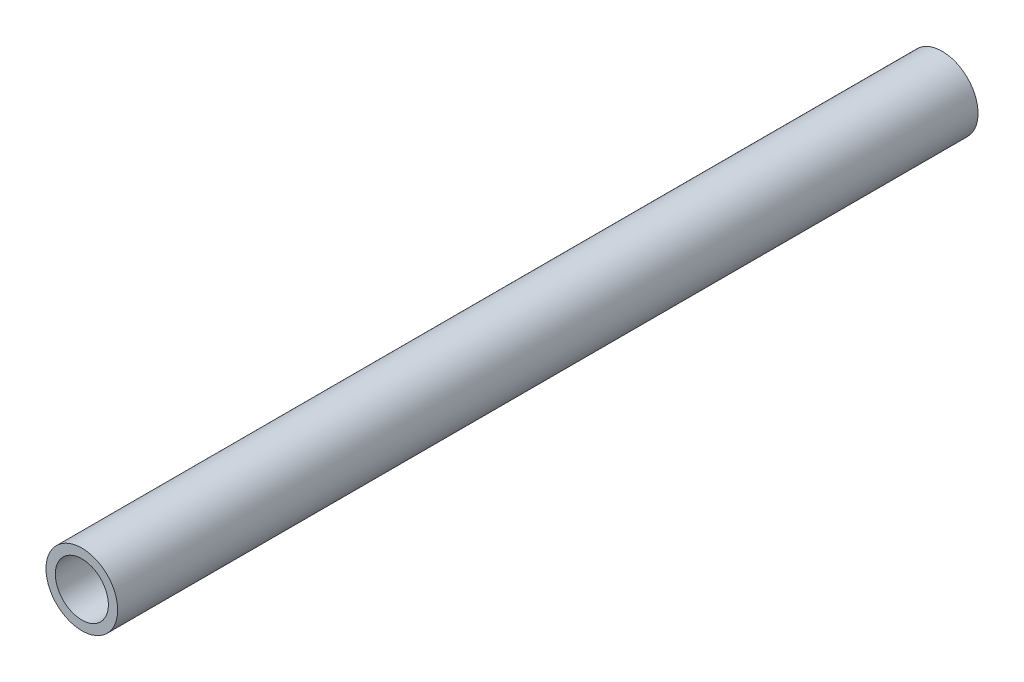
ISO-10303-21;
HEADER;
FILE_DESCRIPTION(('STEP AP214'),'2;1');
FILE_NAME('part.step','',(''),(''),'','','');
FILE_SCHEMA(('AUTOMOTIVE_DESIGN { 1 0 10303 214 1 1 1 1 }'));
ENDSEC;
DATA;
#1=APPLICATION_CONTEXT('core data for automotive mechanical design processes');
#2=APPLICATION_PROTOCOL_DEFINITION('international standard','automotive_design',2000,#1);
#3=PRODUCT_CONTEXT('',#1,'mechanical');
#4=PRODUCT('Part','Part','',(#3));
#5=PRODUCT_RELATED_PRODUCT_CATEGORY('part','',(#4));
#6=PRODUCT_DEFINITION_FORMATION('','',#4);
#7=PRODUCT_DEFINITION_CONTEXT('part definition',#1,'design');
#8=PRODUCT_DEFINITION('design','',#6,#7);
#9=PRODUCT_DEFINITION_SHAPE('','',#8);
#10=(LENGTH_UNIT() NAMED_UNIT(*) SI_UNIT(.MILLI.,.METRE.));
#11=(NAMED_UNIT(*) PLANE_ANGLE_UNIT() SI_UNIT($,.RADIAN.));
#12=(NAMED_UNIT(*) SI_UNIT($,.STERADIAN.) SOLID_ANGLE_UNIT());
#13=UNCERTAINTY_MEASURE_WITH_UNIT(LENGTH_MEASURE(1.E-05),#10,'distance_accuracy_value','');
#14=(GEOMETRIC_REPRESENTATION_CONTEXT(3) GLOBAL_UNCERTAINTY_ASSIGNED_CONTEXT((#13)) GLOBAL_UNIT_ASSIGNED_CONTEXT((#10,
#11,#12)) REPRESENTATION_CONTEXT('',''));
#15=CARTESIAN_POINT('',(0.,0.,0.));
#16=DIRECTION('',(0.,0.,1.));
#17=DIRECTION('',(1.,0.,0.));
#18=AXIS2_PLACEMENT_3D('',#15,#16,#17);
#19=CARTESIAN_POINT('',(0.,0.,76.2));
#20=DIRECTION('',(0.,0.,1.));
#21=DIRECTION('',(1.,0.,0.));
#22=AXIS2_PLACEMENT_3D('',#19,#20,#21);
#23=PLANE('',#22);
#24=CARTESIAN_POINT('',(0.,0.,76.2));
#25=DIRECTION('',(0.,0.,1.));
#26=DIRECTION('',(1.,0.,0.));
#27=AXIS2_PLACEMENT_3D('',#24,#25,#26);
#28=CIRCLE('',#27,6.35);
#29=CARTESIAN_POINT('',(-6.35,0.,76.2));
#30=VERTEX_POINT('',#29);
#31=EDGE_CURVE('E10',#30,#30,#28,.T.);
#32=ORIENTED_EDGE('',*,*,#31,.T.);
#33=EDGE_LOOP('',(#32));
#34=FACE_BOUND('',#33,.T.);
#35=CARTESIAN_POINT('',(0.,0.,76.2));
#36=DIRECTION('',(0.,0.,1.));
#37=DIRECTION('',(1.,0.,0.));
#38=AXIS2_PLACEMENT_3D('',#35,#36,#37);
#39=CIRCLE('',#38,4.699);
#40=CARTESIAN_POINT('',(-4.699,0.,76.2));
#41=VERTEX_POINT('',#40);
#42=EDGE_CURVE('E41',#41,#41,#39,.T.);
#43=ORIENTED_EDGE('',*,*,#42,.F.);
#44=EDGE_LOOP('',(#43));
#45=FACE_BOUND('',#44,.T.);
#46=ADVANCED_FACE('F30',(#34,#45),#23,.T.);
#47=CARTESIAN_POINT('',(0.,0.,-76.2));
#48=DIRECTION('',(0.,0.,1.));
#49=DIRECTION('',(1.,0.,0.));
#50=AXIS2_PLACEMENT_3D('',#47,#48,#49);
#51=PLANE('',#50);
#52=CARTESIAN_POINT('',(0.,0.,-76.2));
#53=DIRECTION('',(0.,0.,1.));
#54=DIRECTION('',(1.,0.,0.));
#55=AXIS2_PLACEMENT_3D('',#52,#53,#54);
#56=CIRCLE('',#55,6.35);
#57=CARTESIAN_POINT('',(-6.35,0.,-76.2));
#58=VERTEX_POINT('',#57);
#59=EDGE_CURVE('E34',#58,#58,#56,.T.);
#60=ORIENTED_EDGE('',*,*,#59,.F.);
#61=EDGE_LOOP('',(#60));
#62=FACE_BOUND('',#61,.T.);
#63=CARTESIAN_POINT('',(0.,0.,-76.2));
#64=DIRECTION('',(0.,0.,1.));
#65=DIRECTION('',(1.,0.,0.));
#66=AXIS2_PLACEMENT_3D('',#63,#64,#65);
#67=CIRCLE('',#66,4.699);
#68=CARTESIAN_POINT('',(-4.699,0.,-76.2));
#69=VERTEX_POINT('',#68);
#70=EDGE_CURVE('E43',#69,#69,#67,.T.);
#71=ORIENTED_EDGE('',*,*,#70,.T.);
#72=EDGE_LOOP('',(#71));
#73=FACE_BOUND('',#72,.T.);
#74=ADVANCED_FACE('F53',(#62,#73),#51,.F.);
#75=CARTESIAN_POINT('',(0.,0.,76.2));
#76=DIRECTION('',(0.,0.,-1.));
#77=DIRECTION('',(-1.,0.,0.));
#78=AXIS2_PLACEMENT_3D('',#75,#76,#77);
#79=CYLINDRICAL_SURFACE('',#78,6.35);
#80=CARTESIAN_POINT('',(-6.35,0.,76.2));
#81=CARTESIAN_POINT('',(-6.35,0.,74.6125));
#82=CARTESIAN_POINT('',(-6.35,0.,73.025));
#83=CARTESIAN_POINT('',(-6.35,0.,69.85));
#84=CARTESIAN_POINT('',(-6.35,0.,68.2625));
#85=CARTESIAN_POINT('',(-6.35,0.,65.0875));
#86=CARTESIAN_POINT('',(-6.35,0.,63.5));
#87=CARTESIAN_POINT('',(-6.35,0.,60.325));
#88=CARTESIAN_POINT('',(-6.35,0.,58.7375));
#89=CARTESIAN_POINT('',(-6.35,0.,55.5625));
#90=CARTESIAN_POINT('',(-6.35,0.,53.975));
#91=CARTESIAN_POINT('',(-6.35,0.,50.8));
#92=CARTESIAN_POINT('',(-6.35,0.,49.2125));
#93=CARTESIAN_POINT('',(-6.35,0.,46.0375));
#94=CARTESIAN_POINT('',(-6.35,0.,44.45));
#95=CARTESIAN_POINT('',(-6.35,0.,41.275));
#96=CARTESIAN_POINT('',(-6.35,0.,39.6875));
#97=CARTESIAN_POINT('',(-6.35,0.,36.5125));
#98=CARTESIAN_POINT('',(-6.35,0.,34.925));
#99=CARTESIAN_POINT('',(-6.35,0.,31.75));
#100=CARTESIAN_POINT('',(-6.35,0.,30.1625));
#101=CARTESIAN_POINT('',(-6.35,0.,26.9875));
#102=CARTESIAN_POINT('',(-6.35,0.,25.4));
#103=CARTESIAN_POINT('',(-6.35,0.,22.225));
#104=CARTESIAN_POINT('',(-6.35,0.,20.6375));
#105=CARTESIAN_POINT('',(-6.35,0.,17.4625));
#106=CARTESIAN_POINT('',(-6.35,0.,15.875));
#107=CARTESIAN_POINT('',(-6.35,0.,12.7));
#108=CARTESIAN_POINT('',(-6.35,0.,11.1125));
#109=CARTESIAN_POINT('',(-6.35,0.,7.93750000000001));
#110=CARTESIAN_POINT('',(-6.35,0.,6.35));
#111=CARTESIAN_POINT('',(-6.35,0.,3.175));
#112=CARTESIAN_POINT('',(-6.35,0.,1.5875));
#113=CARTESIAN_POINT('',(-6.35,0.,-1.5875));
#114=CARTESIAN_POINT('',(-6.35,0.,-3.175));
#115=CARTESIAN_POINT('',(-6.35,0.,-6.35));
#116=CARTESIAN_POINT('',(-6.35,0.,-7.93750000000001));
#117=CARTESIAN_POINT('',(-6.35,0.,-11.1125));
#118=CARTESIAN_POINT('',(-6.35,0.,-12.7));
#119=CARTESIAN_POINT('',(-6.35,0.,-15.875));
#120=CARTESIAN_POINT('',(-6.35,0.,-17.4625));
#121=CARTESIAN_POINT('',(-6.35,0.,-20.6375));
#122=CARTESIAN_POINT('',(-6.35,0.,-22.225));
#123=CARTESIAN_POINT('',(-6.35,0.,-25.4));
#124=CARTESIAN_POINT('',(-6.35,0.,-26.9875));
#125=CARTESIAN_POINT('',(-6.35,0.,-30.1625));
#126=CARTESIAN_POINT('',(-6.35,0.,-31.75));
#127=CARTESIAN_POINT('',(-6.35,0.,-34.925));
#128=CARTESIAN_POINT('',(-6.35,0.,-36.5125));
#129=CARTESIAN_POINT('',(-6.35,0.,-39.6875));
#130=CARTESIAN_POINT('',(-6.35,0.,-41.275));
#131=CARTESIAN_POINT('',(-6.35,0.,-44.45));
#132=CARTESIAN_POINT('',(-6.35,0.,-46.0375));
#133=CARTESIAN_POINT('',(-6.35,0.,-49.2125));
#134=CARTESIAN_POINT('',(-6.35,0.,-50.8));
#135=CARTESIAN_POINT('',(-6.35,0.,-53.975));
#136=CARTESIAN_POINT('',(-6.35,0.,-55.5625));
#137=CARTESIAN_POINT('',(-6.35,0.,-58.7375));
#138=CARTESIAN_POINT('',(-6.35,0.,-60.325));
#139=CARTESIAN_POINT('',(-6.35,0.,-63.5));
#140=CARTESIAN_POINT('',(-6.35,0.,-65.0875));
#141=CARTESIAN_POINT('',(-6.35,0.,-68.2625));
#142=CARTESIAN_POINT('',(-6.35,0.,-69.85));
#143=CARTESIAN_POINT('',(-6.35,0.,-73.025));
#144=CARTESIAN_POINT('',(-6.35,0.,-74.6125));
#145=CARTESIAN_POINT('',(-6.35,0.,-76.2));
#146=B_SPLINE_CURVE_WITH_KNOTS('',3,(#80,#81,#82,#83,#84,#85,#86,#87,#88,#89,#90,#91,#92,#93,
#94,#95,#96,#97,#98,#99,#100,#101,#102,#103,#104,#105,#106,#107,#108,#109,#110,#111,#112,#113,
#114,#115,#116,#117,#118,#119,#120,#121,#122,#123,#124,#125,#126,#127,#128,#129,#130,#131,#132,
#133,#134,#135,#136,#137,#138,#139,#140,#141,#142,#143,#144,#145),.UNSPECIFIED.,.F.,.F.,(4,2,2,
2,2,2,2,2,2,2,2,2,2,2,2,2,2,2,2,2,2,2,2,2,2,2,2,2,2,2,2,2,4),(0.,4.7625,9.52500000000001,
14.2875,19.05,23.8125,28.575,33.3375,38.1,42.8625,47.625,52.3875,57.15,61.9125,66.675,71.4375,
76.2,80.9625,85.725,90.4875,95.25,100.0125,104.775,109.5375,114.3,119.0625,123.825,128.5875,
133.35,138.1125,142.875,147.6375,152.4),.UNSPECIFIED.);
#147=EDGE_CURVE('BSEAM32',#30,#58,#146,.T.);
#148=ORIENTED_EDGE('',*,*,#31,.F.);
#149=ORIENTED_EDGE('',*,*,#59,.T.);
#150=ORIENTED_EDGE('',*,*,#147,.T.);
#151=ORIENTED_EDGE('',*,*,#147,.F.);
#152=EDGE_LOOP('',(#148,#150,#149,#151));
#153=FACE_BOUND('',#152,.T.);
#154=ADVANCED_FACE('F32',(#153),#79,.T.);
#155=CARTESIAN_POINT('',(0.,0.,76.2));
#156=DIRECTION('',(0.,0.,-1.));
#157=DIRECTION('',(-1.,0.,0.));
#158=AXIS2_PLACEMENT_3D('',#155,#156,#157);
#159=CYLINDRICAL_SURFACE('',#158,4.699);
#160=CARTESIAN_POINT('',(-4.699,0.,76.2));
#161=CARTESIAN_POINT('',(-4.699,0.,74.6125));
#162=CARTESIAN_POINT('',(-4.699,0.,73.025));
#163=CARTESIAN_POINT('',(-4.699,0.,69.85));
#164=CARTESIAN_POINT('',(-4.699,0.,68.2625));
#165=CARTESIAN_POINT('',(-4.699,0.,65.0875));
#166=CARTESIAN_POINT('',(-4.699,0.,63.5));
#167=CARTESIAN_POINT('',(-4.699,0.,60.325));
#168=CARTESIAN_POINT('',(-4.699,0.,58.7375));
#169=CARTESIAN_POINT('',(-4.699,0.,55.5625));
#170=CARTESIAN_POINT('',(-4.699,0.,53.975));
#171=CARTESIAN_POINT('',(-4.699,0.,50.8));
#172=CARTESIAN_POINT('',(-4.699,0.,49.2125));
#173=CARTESIAN_POINT('',(-4.699,0.,46.0375));
#174=CARTESIAN_POINT('',(-4.699,0.,44.45));
#175=CARTESIAN_POINT('',(-4.699,0.,41.275));
#176=CARTESIAN_POINT('',(-4.699,0.,39.6875));
#177=CARTESIAN_POINT('',(-4.699,0.,36.5125));
#178=CARTESIAN_POINT('',(-4.699,0.,34.925));
#179=CARTESIAN_POINT('',(-4.699,0.,31.75));
#180=CARTESIAN_POINT('',(-4.699,0.,30.1625));
#181=CARTESIAN_POINT('',(-4.699,0.,26.9875));
#182=CARTESIAN_POINT('',(-4.699,0.,25.4));
#183=CARTESIAN_POINT('',(-4.699,0.,22.225));
#184=CARTESIAN_POINT('',(-4.699,0.,20.6375));
#185=CARTESIAN_POINT('',(-4.699,0.,17.4625));
#186=CARTESIAN_POINT('',(-4.699,0.,15.875));
#187=CARTESIAN_POINT('',(-4.699,0.,12.7));
#188=CARTESIAN_POINT('',(-4.699,0.,11.1125));
#189=CARTESIAN_POINT('',(-4.699,0.,7.93749999999999));
#190=CARTESIAN_POINT('',(-4.699,0.,6.34999999999999));
#191=CARTESIAN_POINT('',(-4.699,0.,3.17499999999999));
#192=CARTESIAN_POINT('',(-4.699,0.,1.58749999999999));
#193=CARTESIAN_POINT('',(-4.699,0.,-1.58750000000001));
#194=CARTESIAN_POINT('',(-4.699,0.,-3.17500000000002));
#195=CARTESIAN_POINT('',(-4.699,0.,-6.35000000000002));
#196=CARTESIAN_POINT('',(-4.699,0.,-7.93750000000002));
#197=CARTESIAN_POINT('',(-4.699,0.,-11.1125));
#198=CARTESIAN_POINT('',(-4.699,0.,-12.7));
#199=CARTESIAN_POINT('',(-4.699,0.,-15.875));
#200=CARTESIAN_POINT('',(-4.699,0.,-17.4625));
#201=CARTESIAN_POINT('',(-4.699,0.,-20.6375));
#202=CARTESIAN_POINT('',(-4.699,0.,-22.225));
#203=CARTESIAN_POINT('',(-4.699,0.,-25.4));
#204=CARTESIAN_POINT('',(-4.699,0.,-26.9875));
#205=CARTESIAN_POINT('',(-4.699,0.,-30.1625));
#206=CARTESIAN_POINT('',(-4.699,0.,-31.75));
#207=CARTESIAN_POINT('',(-4.699,0.,-34.925));
#208=CARTESIAN_POINT('',(-4.699,0.,-36.5125));
#209=CARTESIAN_POINT('',(-4.699,0.,-39.6875));
#210=CARTESIAN_POINT('',(-4.699,0.,-41.275));
#211=CARTESIAN_POINT('',(-4.699,0.,-44.45));
#212=CARTESIAN_POINT('',(-4.699,0.,-46.0375));
#213=CARTESIAN_POINT('',(-4.699,0.,-49.2125));
#214=CARTESIAN_POINT('',(-4.699,0.,-50.8));
#215=CARTESIAN_POINT('',(-4.699,0.,-53.975));
#216=CARTESIAN_POINT('',(-4.699,0.,-55.5625));
#217=CARTESIAN_POINT('',(-4.699,0.,-58.7375));
#218=CARTESIAN_POINT('',(-4.699,0.,-60.325));
#219=CARTESIAN_POINT('',(-4.699,0.,-63.5));
#220=CARTESIAN_POINT('',(-4.699,0.,-65.0875));
#221=CARTESIAN_POINT('',(-4.699,0.,-68.2625));
#222=CARTESIAN_POINT('',(-4.699,0.,-69.85));
#223=CARTESIAN_POINT('',(-4.699,0.,-73.025));
#224=CARTESIAN_POINT('',(-4.699,0.,-74.6125));
#225=CARTESIAN_POINT('',(-4.699,0.,-76.2));
#226=B_SPLINE_CURVE_WITH_KNOTS('',3,(#160,#161,#162,#163,#164,#165,#166,#167,#168,#169,#170,
#171,#172,#173,#174,#175,#176,#177,#178,#179,#180,#181,#182,#183,#184,#185,#186,#187,#188,#189,
#190,#191,#192,#193,#194,#195,#196,#197,#198,#199,#200,#201,#202,#203,#204,#205,#206,#207,#208,
#209,#210,#211,#212,#213,#214,#215,#216,#217,#218,#219,#220,#221,#222,#223,#224,#225),
.UNSPECIFIED.,.F.,.F.,(4,2,2,2,2,2,2,2,2,2,2,2,2,2,2,2,2,2,2,2,2,2,2,2,2,2,2,2,2,2,2,2,4),(0.,
4.76249999999999,9.52499999999999,14.2875,19.05,23.8125,28.575,33.3375,38.1,42.8625,47.625,
52.3875,57.15,61.9125,66.675,71.4375,76.2,80.9625,85.725,90.4875,95.25,100.0125,104.775,
109.5375,114.3,119.0625,123.825,128.5875,133.35,138.1125,142.875,147.6375,152.4),.UNSPECIFIED.);
#227=EDGE_CURVE('BSEAM49',#41,#69,#226,.T.);
#228=ORIENTED_EDGE('',*,*,#42,.T.);
#229=ORIENTED_EDGE('',*,*,#70,.F.);
#230=ORIENTED_EDGE('',*,*,#227,.T.);
#231=ORIENTED_EDGE('',*,*,#227,.F.);
#232=EDGE_LOOP('',(#228,#230,#229,#231));
#233=FACE_BOUND('',#232,.T.);
#234=ADVANCED_FACE('F49',(#233),#159,.F.);
#235=CLOSED_SHELL('',(#46,#74,#154,#234));
#236=MANIFOLD_SOLID_BREP('B2',#235);
#237=ADVANCED_BREP_SHAPE_REPRESENTATION('',(#18,#236),#14);
#238=SHAPE_DEFINITION_REPRESENTATION(#9,#237);
ENDSEC;
END-ISO-10303-21;
